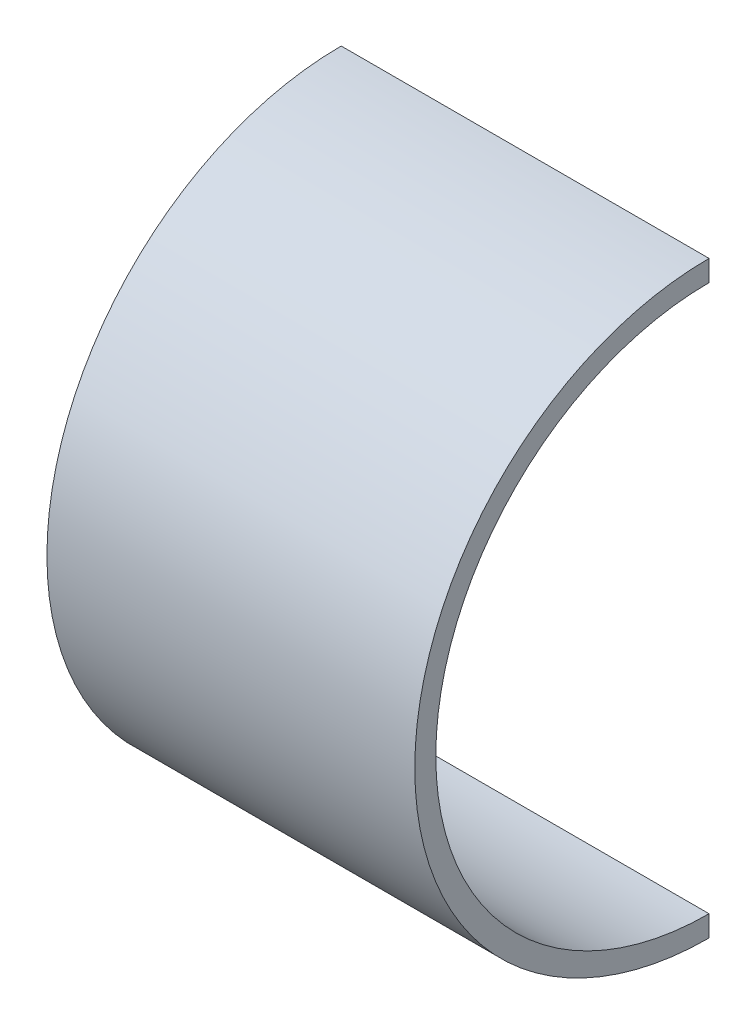
ISO-10303-21;
HEADER;
FILE_DESCRIPTION(('STEP AP214'),'2;1');
FILE_NAME('part.step','',(''),(''),'','','');
FILE_SCHEMA(('AUTOMOTIVE_DESIGN { 1 0 10303 214 1 1 1 1 }'));
ENDSEC;
DATA;
#1=APPLICATION_CONTEXT('core data for automotive mechanical design processes');
#2=APPLICATION_PROTOCOL_DEFINITION('international standard','automotive_design',2000,#1);
#3=PRODUCT_CONTEXT('',#1,'mechanical');
#4=PRODUCT('Part','Part','',(#3));
#5=PRODUCT_RELATED_PRODUCT_CATEGORY('part','',(#4));
#6=PRODUCT_DEFINITION_FORMATION('','',#4);
#7=PRODUCT_DEFINITION_CONTEXT('part definition',#1,'design');
#8=PRODUCT_DEFINITION('design','',#6,#7);
#9=PRODUCT_DEFINITION_SHAPE('','',#8);
#10=(LENGTH_UNIT() NAMED_UNIT(*) SI_UNIT(.MILLI.,.METRE.));
#11=(NAMED_UNIT(*) PLANE_ANGLE_UNIT() SI_UNIT($,.RADIAN.));
#12=(NAMED_UNIT(*) SI_UNIT($,.STERADIAN.) SOLID_ANGLE_UNIT());
#13=UNCERTAINTY_MEASURE_WITH_UNIT(LENGTH_MEASURE(1.E-05),#10,'distance_accuracy_value','');
#14=(GEOMETRIC_REPRESENTATION_CONTEXT(3) GLOBAL_UNCERTAINTY_ASSIGNED_CONTEXT((#13)) GLOBAL_UNIT_ASSIGNED_CONTEXT((#10,
#11,#12)) REPRESENTATION_CONTEXT('',''));
#15=CARTESIAN_POINT('',(0.,0.,0.));
#16=DIRECTION('',(0.,0.,1.));
#17=DIRECTION('',(1.,0.,0.));
#18=AXIS2_PLACEMENT_3D('',#15,#16,#17);
#19=CARTESIAN_POINT('',(889.,0.,0.));
#20=DIRECTION('',(-1.,0.,0.));
#21=DIRECTION('',(0.,0.,1.));
#22=AXIS2_PLACEMENT_3D('',#19,#20,#21);
#23=CYLINDRICAL_SURFACE('',#22,660.4);
#24=CARTESIAN_POINT('',(0.,0.,0.));
#25=DIRECTION('',(-1.,0.,0.));
#26=DIRECTION('',(0.,0.,-1.));
#27=AXIS2_PLACEMENT_3D('',#24,#25,#26);
#28=CIRCLE('',#27,660.4);
#29=CARTESIAN_POINT('',(0.,-660.4,0.));
#30=VERTEX_POINT('',#29);
#31=CARTESIAN_POINT('',(0.,660.4,0.));
#32=VERTEX_POINT('',#31);
#33=EDGE_CURVE('E96',#30,#32,#28,.T.);
#34=ORIENTED_EDGE('',*,*,#33,.T.);
#35=DIRECTION('',(-1.,0.,0.));
#36=VECTOR('',#35,1.);
#37=CARTESIAN_POINT('',(889.,660.4,0.));
#38=LINE('',#37,#36);
#39=CARTESIAN_POINT('',(889.,660.4,0.));
#40=VERTEX_POINT('',#39);
#41=EDGE_CURVE('E11',#40,#32,#38,.T.);
#42=ORIENTED_EDGE('',*,*,#41,.F.);
#43=CARTESIAN_POINT('',(889.,0.,0.));
#44=DIRECTION('',(-1.,0.,0.));
#45=DIRECTION('',(0.,0.,-1.));
#46=AXIS2_PLACEMENT_3D('',#43,#44,#45);
#47=CIRCLE('',#46,660.4);
#48=CARTESIAN_POINT('',(889.,-660.4,0.));
#49=VERTEX_POINT('',#48);
#50=EDGE_CURVE('E84',#49,#40,#47,.T.);
#51=ORIENTED_EDGE('',*,*,#50,.F.);
#52=DIRECTION('',(-1.,0.,0.));
#53=VECTOR('',#52,1.);
#54=CARTESIAN_POINT('',(889.,-660.4,0.));
#55=LINE('',#54,#53);
#56=EDGE_CURVE('E92',#49,#30,#55,.T.);
#57=ORIENTED_EDGE('',*,*,#56,.T.);
#58=EDGE_LOOP('',(#34,#42,#51,#57));
#59=FACE_BOUND('',#58,.T.);
#60=ADVANCED_FACE('F33',(#59),#23,.F.);
#61=CARTESIAN_POINT('',(889.,711.2,0.));
#62=DIRECTION('',(0.,0.,1.));
#63=DIRECTION('',(1.,0.,0.));
#64=AXIS2_PLACEMENT_3D('',#61,#62,#63);
#65=PLANE('',#64);
#66=DIRECTION('',(0.,1.,0.));
#67=VECTOR('',#66,1.);
#68=CARTESIAN_POINT('',(0.,711.2,0.));
#69=LINE('',#68,#67);
#70=CARTESIAN_POINT('',(0.,711.2,0.));
#71=VERTEX_POINT('',#70);
#72=EDGE_CURVE('E88',#32,#71,#69,.T.);
#73=ORIENTED_EDGE('',*,*,#72,.T.);
#74=DIRECTION('',(-1.,0.,0.));
#75=VECTOR('',#74,1.);
#76=CARTESIAN_POINT('',(889.,711.2,0.));
#77=LINE('',#76,#75);
#78=CARTESIAN_POINT('',(889.,711.2,0.));
#79=VERTEX_POINT('',#78);
#80=EDGE_CURVE('E41',#79,#71,#77,.T.);
#81=ORIENTED_EDGE('',*,*,#80,.F.);
#82=DIRECTION('',(0.,1.,0.));
#83=VECTOR('',#82,1.);
#84=CARTESIAN_POINT('',(889.,711.2,0.));
#85=LINE('',#84,#83);
#86=EDGE_CURVE('E79',#40,#79,#85,.T.);
#87=ORIENTED_EDGE('',*,*,#86,.F.);
#88=ORIENTED_EDGE('',*,*,#41,.T.);
#89=EDGE_LOOP('',(#73,#81,#87,#88));
#90=FACE_BOUND('',#89,.T.);
#91=ADVANCED_FACE('F87',(#90),#65,.F.);
#92=CARTESIAN_POINT('',(889.,0.,0.));
#93=DIRECTION('',(-1.,0.,0.));
#94=DIRECTION('',(0.,0.,1.));
#95=AXIS2_PLACEMENT_3D('',#92,#93,#94);
#96=CYLINDRICAL_SURFACE('',#95,711.2);
#97=CARTESIAN_POINT('',(0.,0.,0.));
#98=DIRECTION('',(1.,0.,0.));
#99=DIRECTION('',(0.,0.,-1.));
#100=AXIS2_PLACEMENT_3D('',#97,#98,#99);
#101=CIRCLE('',#100,711.2);
#102=CARTESIAN_POINT('',(0.,-711.2,0.));
#103=VERTEX_POINT('',#102);
#104=EDGE_CURVE('E66',#71,#103,#101,.T.);
#105=ORIENTED_EDGE('',*,*,#104,.T.);
#106=DIRECTION('',(-1.,0.,0.));
#107=VECTOR('',#106,1.);
#108=CARTESIAN_POINT('',(889.,-711.2,0.));
#109=LINE('',#108,#107);
#110=CARTESIAN_POINT('',(889.,-711.2,0.));
#111=VERTEX_POINT('',#110);
#112=EDGE_CURVE('E89',#111,#103,#109,.T.);
#113=ORIENTED_EDGE('',*,*,#112,.F.);
#114=CARTESIAN_POINT('',(889.,0.,0.));
#115=DIRECTION('',(1.,0.,0.));
#116=DIRECTION('',(0.,0.,-1.));
#117=AXIS2_PLACEMENT_3D('',#114,#115,#116);
#118=CIRCLE('',#117,711.2);
#119=EDGE_CURVE('E82',#79,#111,#118,.T.);
#120=ORIENTED_EDGE('',*,*,#119,.F.);
#121=ORIENTED_EDGE('',*,*,#80,.T.);
#122=EDGE_LOOP('',(#105,#113,#120,#121));
#123=FACE_BOUND('',#122,.T.);
#124=ADVANCED_FACE('F90',(#123),#96,.T.);
#125=CARTESIAN_POINT('',(889.,-660.4,0.));
#126=DIRECTION('',(0.,0.,1.));
#127=DIRECTION('',(1.,0.,0.));
#128=AXIS2_PLACEMENT_3D('',#125,#126,#127);
#129=PLANE('',#128);
#130=DIRECTION('',(0.,1.,0.));
#131=VECTOR('',#130,1.);
#132=CARTESIAN_POINT('',(0.,-660.4,0.));
#133=LINE('',#132,#131);
#134=EDGE_CURVE('E72',#103,#30,#133,.T.);
#135=ORIENTED_EDGE('',*,*,#134,.T.);
#136=ORIENTED_EDGE('',*,*,#56,.F.);
#137=DIRECTION('',(0.,1.,0.));
#138=VECTOR('',#137,1.);
#139=CARTESIAN_POINT('',(889.,-660.4,0.));
#140=LINE('',#139,#138);
#141=EDGE_CURVE('E49',#111,#49,#140,.T.);
#142=ORIENTED_EDGE('',*,*,#141,.F.);
#143=ORIENTED_EDGE('',*,*,#112,.T.);
#144=EDGE_LOOP('',(#135,#136,#142,#143));
#145=FACE_BOUND('',#144,.T.);
#146=ADVANCED_FACE('F103',(#145),#129,.F.);
#147=CARTESIAN_POINT('',(889.,0.,0.));
#148=DIRECTION('',(1.,0.,0.));
#149=DIRECTION('',(0.,0.,-1.));
#150=AXIS2_PLACEMENT_3D('',#147,#148,#149);
#151=PLANE('',#150);
#152=ORIENTED_EDGE('',*,*,#50,.T.);
#153=ORIENTED_EDGE('',*,*,#86,.T.);
#154=ORIENTED_EDGE('',*,*,#119,.T.);
#155=ORIENTED_EDGE('',*,*,#141,.T.);
#156=EDGE_LOOP('',(#152,#153,#154,#155));
#157=FACE_BOUND('',#156,.T.);
#158=ADVANCED_FACE('F80',(#157),#151,.T.);
#159=CARTESIAN_POINT('',(0.,0.,0.));
#160=DIRECTION('',(1.,0.,0.));
#161=DIRECTION('',(0.,0.,-1.));
#162=AXIS2_PLACEMENT_3D('',#159,#160,#161);
#163=PLANE('',#162);
#164=ORIENTED_EDGE('',*,*,#33,.F.);
#165=ORIENTED_EDGE('',*,*,#134,.F.);
#166=ORIENTED_EDGE('',*,*,#104,.F.);
#167=ORIENTED_EDGE('',*,*,#72,.F.);
#168=EDGE_LOOP('',(#164,#165,#166,#167));
#169=FACE_BOUND('',#168,.T.);
#170=ADVANCED_FACE('F106',(#169),#163,.F.);
#171=CLOSED_SHELL('',(#60,#91,#124,#146,#158,#170));
#172=MANIFOLD_SOLID_BREP('B2',#171);
#173=ADVANCED_BREP_SHAPE_REPRESENTATION('',(#18,#172),#14);
#174=SHAPE_DEFINITION_REPRESENTATION(#9,#173);
ENDSEC;
END-ISO-10303-21;
